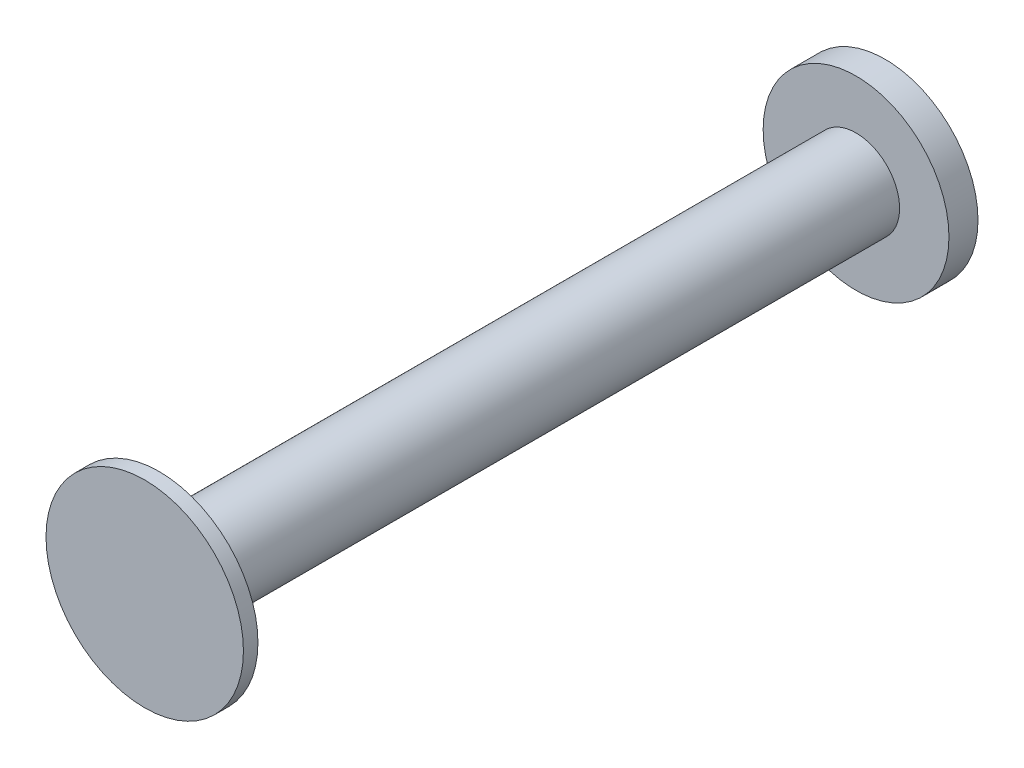
ISO-10303-21;
HEADER;
FILE_DESCRIPTION(('STEP AP214'),'2;1');
FILE_NAME('part.step','',(''),(''),'','','');
FILE_SCHEMA(('AUTOMOTIVE_DESIGN { 1 0 10303 214 1 1 1 1 }'));
ENDSEC;
DATA;
#1=APPLICATION_CONTEXT('core data for automotive mechanical design processes');
#2=APPLICATION_PROTOCOL_DEFINITION('international standard','automotive_design',2000,#1);
#3=PRODUCT_CONTEXT('',#1,'mechanical');
#4=PRODUCT('Part','Part','',(#3));
#5=PRODUCT_RELATED_PRODUCT_CATEGORY('part','',(#4));
#6=PRODUCT_DEFINITION_FORMATION('','',#4);
#7=PRODUCT_DEFINITION_CONTEXT('part definition',#1,'design');
#8=PRODUCT_DEFINITION('design','',#6,#7);
#9=PRODUCT_DEFINITION_SHAPE('','',#8);
#10=(LENGTH_UNIT() NAMED_UNIT(*) SI_UNIT(.MILLI.,.METRE.));
#11=(NAMED_UNIT(*) PLANE_ANGLE_UNIT() SI_UNIT($,.RADIAN.));
#12=(NAMED_UNIT(*) SI_UNIT($,.STERADIAN.) SOLID_ANGLE_UNIT());
#13=UNCERTAINTY_MEASURE_WITH_UNIT(LENGTH_MEASURE(1.E-05),#10,'distance_accuracy_value','');
#14=(GEOMETRIC_REPRESENTATION_CONTEXT(3) GLOBAL_UNCERTAINTY_ASSIGNED_CONTEXT((#13)) GLOBAL_UNIT_ASSIGNED_CONTEXT((#10,
#11,#12)) REPRESENTATION_CONTEXT('',''));
#15=CARTESIAN_POINT('',(0.,0.,0.));
#16=DIRECTION('',(0.,0.,1.));
#17=DIRECTION('',(1.,0.,0.));
#18=AXIS2_PLACEMENT_3D('',#15,#16,#17);
#19=CARTESIAN_POINT('',(0.,0.,6.35));
#20=DIRECTION('',(0.,0.,-1.));
#21=DIRECTION('',(-1.,0.,0.));
#22=AXIS2_PLACEMENT_3D('',#19,#20,#21);
#23=CYLINDRICAL_SURFACE('',#22,20.32);
#24=CARTESIAN_POINT('',(0.,0.,6.35));
#25=DIRECTION('',(0.,0.,1.));
#26=DIRECTION('',(1.,0.,0.));
#27=AXIS2_PLACEMENT_3D('',#24,#25,#26);
#28=CIRCLE('',#27,20.32);
#29=CARTESIAN_POINT('',(20.32,0.,6.35));
#30=VERTEX_POINT('',#29);
#31=EDGE_CURVE('E45',#30,#30,#28,.T.);
#32=ORIENTED_EDGE('',*,*,#31,.F.);
#33=EDGE_LOOP('',(#32));
#34=FACE_BOUND('',#33,.T.);
#35=CARTESIAN_POINT('',(0.,0.,0.));
#36=DIRECTION('',(0.,0.,1.));
#37=DIRECTION('',(1.,0.,0.));
#38=AXIS2_PLACEMENT_3D('',#35,#36,#37);
#39=CIRCLE('',#38,20.32);
#40=CARTESIAN_POINT('',(20.32,0.,0.));
#41=VERTEX_POINT('',#40);
#42=EDGE_CURVE('E40',#41,#41,#39,.T.);
#43=ORIENTED_EDGE('',*,*,#42,.T.);
#44=EDGE_LOOP('',(#43));
#45=FACE_BOUND('',#44,.T.);
#46=ADVANCED_FACE('F37',(#34,#45),#23,.T.);
#47=CARTESIAN_POINT('',(0.,0.,6.35));
#48=DIRECTION('',(0.,0.,1.));
#49=DIRECTION('',(1.,0.,0.));
#50=AXIS2_PLACEMENT_3D('',#47,#48,#49);
#51=PLANE('',#50);
#52=CARTESIAN_POINT('',(0.,0.,6.35));
#53=DIRECTION('',(0.,0.,1.));
#54=DIRECTION('',(1.,0.,0.));
#55=AXIS2_PLACEMENT_3D('',#52,#53,#54);
#56=CIRCLE('',#55,9.525);
#57=CARTESIAN_POINT('',(-9.525,0.,6.34999999999999));
#58=VERTEX_POINT('',#57);
#59=EDGE_CURVE('E10',#58,#58,#56,.T.);
#60=ORIENTED_EDGE('',*,*,#59,.F.);
#61=EDGE_LOOP('',(#60));
#62=FACE_BOUND('',#61,.T.);
#63=ORIENTED_EDGE('',*,*,#31,.T.);
#64=EDGE_LOOP('',(#63));
#65=FACE_BOUND('',#64,.T.);
#66=ADVANCED_FACE('F83',(#62,#65),#51,.T.);
#67=CARTESIAN_POINT('',(0.,0.,0.));
#68=DIRECTION('',(0.,0.,1.));
#69=DIRECTION('',(1.,0.,0.));
#70=AXIS2_PLACEMENT_3D('',#67,#68,#69);
#71=PLANE('',#70);
#72=ORIENTED_EDGE('',*,*,#42,.F.);
#73=EDGE_LOOP('',(#72));
#74=FACE_BOUND('',#73,.T.);
#75=ADVANCED_FACE('F88',(#74),#71,.F.);
#76=CARTESIAN_POINT('',(0.,0.,158.75));
#77=DIRECTION('',(0.,0.,-1.));
#78=DIRECTION('',(-1.,0.,0.));
#79=AXIS2_PLACEMENT_3D('',#76,#77,#78);
#80=CYLINDRICAL_SURFACE('',#79,9.525);
#81=CARTESIAN_POINT('',(0.,0.,158.75));
#82=DIRECTION('',(0.,0.,1.));
#83=DIRECTION('',(1.,0.,0.));
#84=AXIS2_PLACEMENT_3D('',#81,#82,#83);
#85=CIRCLE('',#84,9.525);
#86=CARTESIAN_POINT('',(-9.525,0.,158.75));
#87=VERTEX_POINT('',#86);
#88=EDGE_CURVE('E52',#87,#87,#85,.T.);
#89=CARTESIAN_POINT('',(-9.525,0.,158.75));
#90=CARTESIAN_POINT('',(-9.525,0.,157.1625));
#91=CARTESIAN_POINT('',(-9.525,0.,155.575));
#92=CARTESIAN_POINT('',(-9.525,0.,152.4));
#93=CARTESIAN_POINT('',(-9.525,0.,150.8125));
#94=CARTESIAN_POINT('',(-9.525,0.,147.6375));
#95=CARTESIAN_POINT('',(-9.525,0.,146.05));
#96=CARTESIAN_POINT('',(-9.525,0.,142.875));
#97=CARTESIAN_POINT('',(-9.525,0.,141.2875));
#98=CARTESIAN_POINT('',(-9.525,0.,138.1125));
#99=CARTESIAN_POINT('',(-9.525,0.,136.525));
#100=CARTESIAN_POINT('',(-9.525,0.,133.35));
#101=CARTESIAN_POINT('',(-9.525,0.,131.7625));
#102=CARTESIAN_POINT('',(-9.525,0.,128.5875));
#103=CARTESIAN_POINT('',(-9.525,0.,127.));
#104=CARTESIAN_POINT('',(-9.525,0.,123.825));
#105=CARTESIAN_POINT('',(-9.525,0.,122.2375));
#106=CARTESIAN_POINT('',(-9.525,0.,119.0625));
#107=CARTESIAN_POINT('',(-9.525,0.,117.475));
#108=CARTESIAN_POINT('',(-9.525,0.,114.3));
#109=CARTESIAN_POINT('',(-9.525,0.,112.7125));
#110=CARTESIAN_POINT('',(-9.525,0.,109.5375));
#111=CARTESIAN_POINT('',(-9.525,0.,107.95));
#112=CARTESIAN_POINT('',(-9.525,0.,104.775));
#113=CARTESIAN_POINT('',(-9.525,0.,103.1875));
#114=CARTESIAN_POINT('',(-9.525,0.,100.0125));
#115=CARTESIAN_POINT('',(-9.525,0.,98.425));
#116=CARTESIAN_POINT('',(-9.525,0.,95.25));
#117=CARTESIAN_POINT('',(-9.525,0.,93.6625));
#118=CARTESIAN_POINT('',(-9.525,0.,90.4875));
#119=CARTESIAN_POINT('',(-9.525,0.,88.9));
#120=CARTESIAN_POINT('',(-9.525,0.,85.725));
#121=CARTESIAN_POINT('',(-9.525,0.,84.1375));
#122=CARTESIAN_POINT('',(-9.525,0.,80.9625));
#123=CARTESIAN_POINT('',(-9.525,0.,79.375));
#124=CARTESIAN_POINT('',(-9.525,0.,76.2));
#125=CARTESIAN_POINT('',(-9.525,0.,74.6125));
#126=CARTESIAN_POINT('',(-9.525,0.,71.4375));
#127=CARTESIAN_POINT('',(-9.525,0.,69.85));
#128=CARTESIAN_POINT('',(-9.525,0.,66.675));
#129=CARTESIAN_POINT('',(-9.525,0.,65.0875));
#130=CARTESIAN_POINT('',(-9.525,0.,61.9125));
#131=CARTESIAN_POINT('',(-9.525,0.,60.325));
#132=CARTESIAN_POINT('',(-9.525,0.,57.15));
#133=CARTESIAN_POINT('',(-9.525,0.,55.5625));
#134=CARTESIAN_POINT('',(-9.525,0.,52.3875));
#135=CARTESIAN_POINT('',(-9.525,0.,50.8));
#136=CARTESIAN_POINT('',(-9.525,0.,47.625));
#137=CARTESIAN_POINT('',(-9.525,0.,46.0375));
#138=CARTESIAN_POINT('',(-9.525,0.,42.8625));
#139=CARTESIAN_POINT('',(-9.525,0.,41.275));
#140=CARTESIAN_POINT('',(-9.525,0.,38.1));
#141=CARTESIAN_POINT('',(-9.525,0.,36.5125));
#142=CARTESIAN_POINT('',(-9.525,0.,33.3375));
#143=CARTESIAN_POINT('',(-9.525,0.,31.75));
#144=CARTESIAN_POINT('',(-9.525,0.,28.575));
#145=CARTESIAN_POINT('',(-9.525,0.,26.9875));
#146=CARTESIAN_POINT('',(-9.525,0.,23.8125));
#147=CARTESIAN_POINT('',(-9.525,0.,22.225));
#148=CARTESIAN_POINT('',(-9.525,0.,19.05));
#149=CARTESIAN_POINT('',(-9.525,0.,17.4625));
#150=CARTESIAN_POINT('',(-9.525,0.,14.2875));
#151=CARTESIAN_POINT('',(-9.525,0.,12.7));
#152=CARTESIAN_POINT('',(-9.525,0.,9.525));
#153=CARTESIAN_POINT('',(-9.525,0.,7.9375));
#154=CARTESIAN_POINT('',(-9.525,0.,6.34999999999999));
#155=B_SPLINE_CURVE_WITH_KNOTS('',3,(#89,#90,#91,#92,#93,#94,#95,#96,#97,#98,#99,#100,#101,#102,
#103,#104,#105,#106,#107,#108,#109,#110,#111,#112,#113,#114,#115,#116,#117,#118,#119,#120,#121,
#122,#123,#124,#125,#126,#127,#128,#129,#130,#131,#132,#133,#134,#135,#136,#137,#138,#139,#140,
#141,#142,#143,#144,#145,#146,#147,#148,#149,#150,#151,#152,#153,#154),.UNSPECIFIED.,.F.,.F.,(4,
2,2,2,2,2,2,2,2,2,2,2,2,2,2,2,2,2,2,2,2,2,2,2,2,2,2,2,2,2,2,2,4),(0.,4.7625,9.52500000000001,
14.2875,19.05,23.8125,28.575,33.3375,38.1,42.8625,47.625,52.3875,57.15,61.9125,66.675,71.4375,
76.2,80.9625,85.725,90.4875,95.25,100.0125,104.775,109.5375,114.3,119.0625,123.825,128.5875,
133.35,138.1125,142.875,147.6375,152.4),.UNSPECIFIED.);
#156=EDGE_CURVE('BSEAM70',#87,#58,#155,.T.);
#157=ORIENTED_EDGE('',*,*,#88,.F.);
#158=ORIENTED_EDGE('',*,*,#59,.T.);
#159=ORIENTED_EDGE('',*,*,#156,.T.);
#160=ORIENTED_EDGE('',*,*,#156,.F.);
#161=EDGE_LOOP('',(#157,#159,#158,#160));
#162=FACE_BOUND('',#161,.T.);
#163=ADVANCED_FACE('F70',(#162),#80,.T.);
#164=CARTESIAN_POINT('',(0.,0.,161.925));
#165=DIRECTION('',(0.,0.,-1.));
#166=DIRECTION('',(-1.,0.,0.));
#167=AXIS2_PLACEMENT_3D('',#164,#165,#166);
#168=CYLINDRICAL_SURFACE('',#167,21.59);
#169=CARTESIAN_POINT('',(0.,0.,161.925));
#170=DIRECTION('',(0.,0.,1.));
#171=DIRECTION('',(1.,0.,0.));
#172=AXIS2_PLACEMENT_3D('',#169,#170,#171);
#173=CIRCLE('',#172,21.59);
#174=CARTESIAN_POINT('',(21.59,0.,161.925));
#175=VERTEX_POINT('',#174);
#176=EDGE_CURVE('E56',#175,#175,#173,.T.);
#177=ORIENTED_EDGE('',*,*,#176,.F.);
#178=EDGE_LOOP('',(#177));
#179=FACE_BOUND('',#178,.T.);
#180=CARTESIAN_POINT('',(0.,0.,158.75));
#181=DIRECTION('',(0.,0.,1.));
#182=DIRECTION('',(1.,0.,0.));
#183=AXIS2_PLACEMENT_3D('',#180,#181,#182);
#184=CIRCLE('',#183,21.59);
#185=CARTESIAN_POINT('',(21.59,0.,158.75));
#186=VERTEX_POINT('',#185);
#187=EDGE_CURVE('E57',#186,#186,#184,.T.);
#188=ORIENTED_EDGE('',*,*,#187,.T.);
#189=EDGE_LOOP('',(#188));
#190=FACE_BOUND('',#189,.T.);
#191=ADVANCED_FACE('F67',(#179,#190),#168,.T.);
#192=CARTESIAN_POINT('',(0.,0.,161.925));
#193=DIRECTION('',(0.,0.,1.));
#194=DIRECTION('',(1.,0.,0.));
#195=AXIS2_PLACEMENT_3D('',#192,#193,#194);
#196=PLANE('',#195);
#197=ORIENTED_EDGE('',*,*,#176,.T.);
#198=EDGE_LOOP('',(#197));
#199=FACE_BOUND('',#198,.T.);
#200=ADVANCED_FACE('F65',(#199),#196,.T.);
#201=CARTESIAN_POINT('',(0.,0.,158.75));
#202=DIRECTION('',(0.,0.,1.));
#203=DIRECTION('',(1.,0.,0.));
#204=AXIS2_PLACEMENT_3D('',#201,#202,#203);
#205=PLANE('',#204);
#206=ORIENTED_EDGE('',*,*,#88,.T.);
#207=EDGE_LOOP('',(#206));
#208=FACE_BOUND('',#207,.T.);
#209=ORIENTED_EDGE('',*,*,#187,.F.);
#210=EDGE_LOOP('',(#209));
#211=FACE_BOUND('',#210,.T.);
#212=ADVANCED_FACE('F74',(#208,#211),#205,.F.);
#213=CLOSED_SHELL('',(#46,#66,#75,#163,#191,#200,#212));
#214=MANIFOLD_SOLID_BREP('B2',#213);
#215=ADVANCED_BREP_SHAPE_REPRESENTATION('',(#18,#214),#14);
#216=SHAPE_DEFINITION_REPRESENTATION(#9,#215);
ENDSEC;
END-ISO-10303-21;
